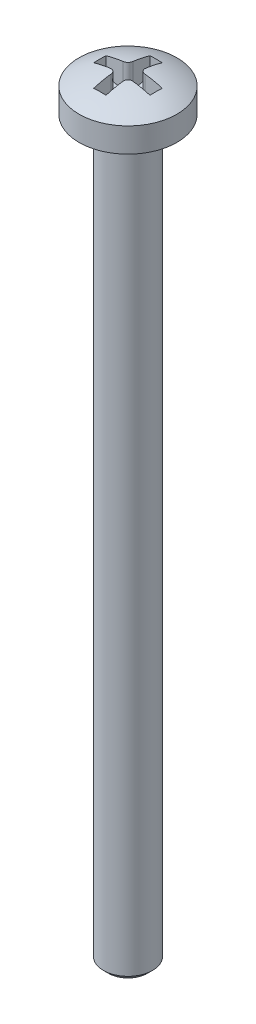
ISO-10303-21;
HEADER;
FILE_DESCRIPTION(('STEP AP214'),'2;1');
FILE_NAME('part.step','',(''),(''),'','','');
FILE_SCHEMA(('AUTOMOTIVE_DESIGN { 1 0 10303 214 1 1 1 1 }'));
ENDSEC;
DATA;
#1=APPLICATION_CONTEXT('core data for automotive mechanical design processes');
#2=APPLICATION_PROTOCOL_DEFINITION('international standard','automotive_design',2000,#1);
#3=PRODUCT_CONTEXT('',#1,'mechanical');
#4=PRODUCT('Part','Part','',(#3));
#5=PRODUCT_RELATED_PRODUCT_CATEGORY('part','',(#4));
#6=PRODUCT_DEFINITION_FORMATION('','',#4);
#7=PRODUCT_DEFINITION_CONTEXT('part definition',#1,'design');
#8=PRODUCT_DEFINITION('design','',#6,#7);
#9=PRODUCT_DEFINITION_SHAPE('','',#8);
#10=(LENGTH_UNIT() NAMED_UNIT(*) SI_UNIT(.MILLI.,.METRE.));
#11=(NAMED_UNIT(*) PLANE_ANGLE_UNIT() SI_UNIT($,.RADIAN.));
#12=(NAMED_UNIT(*) SI_UNIT($,.STERADIAN.) SOLID_ANGLE_UNIT());
#13=UNCERTAINTY_MEASURE_WITH_UNIT(LENGTH_MEASURE(1.E-05),#10,'distance_accuracy_value','');
#14=(GEOMETRIC_REPRESENTATION_CONTEXT(3) GLOBAL_UNCERTAINTY_ASSIGNED_CONTEXT((#13)) GLOBAL_UNIT_ASSIGNED_CONTEXT((#10,
#11,#12)) REPRESENTATION_CONTEXT('',''));
#15=CARTESIAN_POINT('',(0.,0.,0.));
#16=DIRECTION('',(0.,0.,1.));
#17=DIRECTION('',(1.,0.,0.));
#18=AXIS2_PLACEMENT_3D('',#15,#16,#17);
#19=CARTESIAN_POINT('',(2.00000000000001,-60.,0.));
#20=DIRECTION('',(0.,1.,0.));
#21=DIRECTION('',(0.,0.,1.));
#22=AXIS2_PLACEMENT_3D('',#19,#20,#21);
#23=PLANE('',#22);
#24=CARTESIAN_POINT('',(0.,-60.,0.));
#25=DIRECTION('',(0.,1.,0.));
#26=DIRECTION('',(0.,0.,1.));
#27=AXIS2_PLACEMENT_3D('',#24,#25,#26);
#28=CIRCLE('',#27,1.6);
#29=CARTESIAN_POINT('',(0.,-60.,1.6));
#30=VERTEX_POINT('',#29);
#31=EDGE_CURVE('E11',#30,#30,#28,.F.);
#32=ORIENTED_EDGE('',*,*,#31,.T.);
#33=EDGE_LOOP('',(#32));
#34=FACE_BOUND('',#33,.T.);
#35=ADVANCED_FACE('F37',(#34),#23,.F.);
#36=CARTESIAN_POINT('',(0.,-4.72272727272728,0.));
#37=DIRECTION('',(0.,1.,0.));
#38=DIRECTION('',(1.,0.,0.));
#39=AXIS2_PLACEMENT_3D('',#36,#37,#38);
#40=SPHERICAL_SURFACE('',#39,7.82272727272728);
#41=CARTESIAN_POINT('',(0.5,-4.72272727272728,0.));
#42=DIRECTION('',(1.,0.,0.));
#43=DIRECTION('',(0.,0.,-1.));
#44=AXIS2_PLACEMENT_3D('',#41,#42,#43);
#45=CIRCLE('',#44,7.80673183755348);
#46=CARTESIAN_POINT('',(0.5,2.73750476008987,-2.3));
#47=VERTEX_POINT('',#46);
#48=CARTESIAN_POINT('',(0.5,3.03195273249996,-0.9));
#49=VERTEX_POINT('',#48);
#50=EDGE_CURVE('E195',#47,#49,#45,.T.);
#51=ORIENTED_EDGE('',*,*,#50,.T.);
#52=CARTESIAN_POINT('',(0.5,3.03195273249996,-0.9));
#53=CARTESIAN_POINT('',(0.499980445653111,3.03454133641409,-0.877715199489853));
#54=CARTESIAN_POINT('',(0.501861325410847,3.0369109081898,-0.855406290685576));
#55=CARTESIAN_POINT('',(0.509308944557218,3.04115309750786,-0.811373363194762));
#56=CARTESIAN_POINT('',(0.514874142284133,3.04302592244948,-0.789649103823202));
#57=CARTESIAN_POINT('',(0.529581237998282,3.04621922226135,-0.747382590966706));
#58=CARTESIAN_POINT('',(0.538725894104163,3.0475392695665,-0.726841263013532));
#59=CARTESIAN_POINT('',(0.560335395409864,3.04958563422558,-0.687561895208892));
#60=CARTESIAN_POINT('',(0.572799188800053,3.05031213937239,-0.668823286645484));
#61=CARTESIAN_POINT('',(0.600596407799792,3.05114682561896,-0.633816736919395));
#62=CARTESIAN_POINT('',(0.615908512897499,3.05125942358876,-0.617531968951503));
#63=CARTESIAN_POINT('',(0.649026593510928,3.0508747494218,-0.587736528915892));
#64=CARTESIAN_POINT('',(0.666832948845617,3.05037738431157,-0.57422628012003));
#65=CARTESIAN_POINT('',(0.704363578386314,3.04879030089852,-0.550401537052683));
#66=CARTESIAN_POINT('',(0.724081674108829,3.04770244181268,-0.540077170971166));
#67=CARTESIAN_POINT('',(0.764919862434989,3.04496752601447,-0.522847557382613));
#68=CARTESIAN_POINT('',(0.786039420133905,3.04332068167708,-0.515941013789886));
#69=CARTESIAN_POINT('',(0.822714805755103,3.04007942212771,-0.5072274099574));
#70=CARTESIAN_POINT('',(0.838074093965798,3.03861284502167,-0.504517057384848));
#71=CARTESIAN_POINT('',(0.868957976534767,3.0354499847468,-0.500903202638105));
#72=CARTESIAN_POINT('',(0.88448230264661,3.03375403356009,-0.499997118337815));
#73=CARTESIAN_POINT('',(0.9,3.03195273249996,-0.5));
#74=B_SPLINE_CURVE_WITH_KNOTS('',3,(#52,#53,#54,#55,#56,#57,#58,#59,#60,#61,#62,#63,#64,#65,#66,
#67,#68,#69,#70,#71,#72,#73),.UNSPECIFIED.,.F.,.F.,(4,2,2,2,2,2,2,2,2,2,4),(0.,
0.0672224170043276,0.134416723302517,0.201662907801201,0.26888780779591,0.335628401088124,
0.402379168562592,0.468920974876219,0.535437528240593,0.582332561709017,0.629160434341086),.UNSPECIFIED.);
#75=CARTESIAN_POINT('',(0.9,3.03195273249996,-0.5));
#76=VERTEX_POINT('',#75);
#77=EDGE_CURVE('E257',#49,#76,#74,.T.);
#78=ORIENTED_EDGE('',*,*,#77,.T.);
#79=CARTESIAN_POINT('',(0.,-4.72272727272728,-0.5));
#80=DIRECTION('',(0.,0.,-1.));
#81=DIRECTION('',(-1.,0.,0.));
#82=AXIS2_PLACEMENT_3D('',#79,#80,#81);
#83=CIRCLE('',#82,7.80673183755348);
#84=CARTESIAN_POINT('',(2.3,2.73750476008987,-0.5));
#85=VERTEX_POINT('',#84);
#86=EDGE_CURVE('E193',#76,#85,#83,.T.);
#87=ORIENTED_EDGE('',*,*,#86,.T.);
#88=CARTESIAN_POINT('',(2.3,-4.72272727272728,0.));
#89=DIRECTION('',(1.,0.,0.));
#90=DIRECTION('',(0.,0.,-1.));
#91=AXIS2_PLACEMENT_3D('',#88,#89,#90);
#92=CIRCLE('',#91,7.47696876972688);
#93=CARTESIAN_POINT('',(2.3,2.73750476008987,0.5));
#94=VERTEX_POINT('',#93);
#95=EDGE_CURVE('E170',#85,#94,#92,.T.);
#96=ORIENTED_EDGE('',*,*,#95,.T.);
#97=CARTESIAN_POINT('',(0.,-4.72272727272728,0.5));
#98=DIRECTION('',(0.,0.,1.));
#99=DIRECTION('',(1.,0.,0.));
#100=AXIS2_PLACEMENT_3D('',#97,#98,#99);
#101=CIRCLE('',#100,7.80673183755348);
#102=CARTESIAN_POINT('',(0.9,3.03195273249996,0.5));
#103=VERTEX_POINT('',#102);
#104=EDGE_CURVE('E219',#94,#103,#101,.T.);
#105=ORIENTED_EDGE('',*,*,#104,.T.);
#106=CARTESIAN_POINT('',(0.9,3.03195273249996,0.5));
#107=CARTESIAN_POINT('',(0.877715199489853,3.03454133641409,0.499980445653111));
#108=CARTESIAN_POINT('',(0.855406290685576,3.0369109081898,0.501861325410847));
#109=CARTESIAN_POINT('',(0.811373363194762,3.04115309750786,0.509308944557218));
#110=CARTESIAN_POINT('',(0.789649103823202,3.04302592244948,0.514874142284133));
#111=CARTESIAN_POINT('',(0.747382590966706,3.04621922226135,0.529581237998282));
#112=CARTESIAN_POINT('',(0.726841263013532,3.0475392695665,0.538725894104163));
#113=CARTESIAN_POINT('',(0.687561895208891,3.04958563422558,0.560335395409864));
#114=CARTESIAN_POINT('',(0.668823286645484,3.05031213937239,0.572799188800053));
#115=CARTESIAN_POINT('',(0.633816736919395,3.05114682561896,0.600596407799792));
#116=CARTESIAN_POINT('',(0.617531968951503,3.05125942358877,0.6159085128975));
#117=CARTESIAN_POINT('',(0.587736528915892,3.0508747494218,0.649026593510929));
#118=CARTESIAN_POINT('',(0.57422628012003,3.05037738431157,0.666832948845617));
#119=CARTESIAN_POINT('',(0.550401537052683,3.04879030089852,0.704363578386314));
#120=CARTESIAN_POINT('',(0.540077170971166,3.04770244181268,0.724081674108829));
#121=CARTESIAN_POINT('',(0.522847557382613,3.04496752601447,0.764919862434989));
#122=CARTESIAN_POINT('',(0.515941013789886,3.04332068167708,0.786039420133905));
#123=CARTESIAN_POINT('',(0.5072274099574,3.04007942212771,0.822714805755103));
#124=CARTESIAN_POINT('',(0.504517057384848,3.03861284502167,0.838074093965798));
#125=CARTESIAN_POINT('',(0.500903202638105,3.03544998474679,0.868957976534767));
#126=CARTESIAN_POINT('',(0.499997118337815,3.03375403356009,0.884482302646609));
#127=CARTESIAN_POINT('',(0.5,3.03195273249996,0.9));
#128=B_SPLINE_CURVE_WITH_KNOTS('',3,(#106,#107,#108,#109,#110,#111,#112,#113,#114,#115,#116,
#117,#118,#119,#120,#121,#122,#123,#124,#125,#126,#127),.UNSPECIFIED.,.F.,.F.,(4,2,2,2,2,2,2,2,
2,2,4),(0.,0.0672224170043276,0.134416723302517,0.201662907801201,0.268887807795911,
0.335628401088124,0.402379168562592,0.468920974876219,0.535437528240593,0.582332561709017,
0.629160434341086),.UNSPECIFIED.);
#129=CARTESIAN_POINT('',(0.5,3.03195273249996,0.9));
#130=VERTEX_POINT('',#129);
#131=EDGE_CURVE('E252',#103,#130,#128,.T.);
#132=ORIENTED_EDGE('',*,*,#131,.T.);
#133=CARTESIAN_POINT('',(0.5,-4.72272727272728,0.));
#134=DIRECTION('',(1.,0.,0.));
#135=DIRECTION('',(0.,0.,-1.));
#136=AXIS2_PLACEMENT_3D('',#133,#134,#135);
#137=CIRCLE('',#136,7.80673183755348);
#138=CARTESIAN_POINT('',(0.5,2.73750476008987,2.3));
#139=VERTEX_POINT('',#138);
#140=EDGE_CURVE('E217',#130,#139,#137,.T.);
#141=ORIENTED_EDGE('',*,*,#140,.T.);
#142=CARTESIAN_POINT('',(0.,-4.72272727272728,2.3));
#143=DIRECTION('',(0.,0.,1.));
#144=DIRECTION('',(1.,0.,0.));
#145=AXIS2_PLACEMENT_3D('',#142,#143,#144);
#146=CIRCLE('',#145,7.47696876972688);
#147=CARTESIAN_POINT('',(-0.5,2.73750476008987,2.3));
#148=VERTEX_POINT('',#147);
#149=EDGE_CURVE('E214',#139,#148,#146,.T.);
#150=ORIENTED_EDGE('',*,*,#149,.T.);
#151=CARTESIAN_POINT('',(-0.5,-4.72272727272728,0.));
#152=DIRECTION('',(-1.,0.,0.));
#153=DIRECTION('',(0.,0.,1.));
#154=AXIS2_PLACEMENT_3D('',#151,#152,#153);
#155=CIRCLE('',#154,7.80673183755348);
#156=CARTESIAN_POINT('',(-0.5,3.03195273249996,0.9));
#157=VERTEX_POINT('',#156);
#158=EDGE_CURVE('E211',#148,#157,#155,.T.);
#159=ORIENTED_EDGE('',*,*,#158,.T.);
#160=CARTESIAN_POINT('',(-0.5,3.03195273249996,0.9));
#161=CARTESIAN_POINT('',(-0.499980445653111,3.03454133641409,0.877715199489853));
#162=CARTESIAN_POINT('',(-0.501861325410847,3.0369109081898,0.855406290685576));
#163=CARTESIAN_POINT('',(-0.509308944557218,3.04115309750786,0.811373363194762));
#164=CARTESIAN_POINT('',(-0.514874142284133,3.04302592244948,0.789649103823202));
#165=CARTESIAN_POINT('',(-0.529581237998282,3.04621922226135,0.747382590966706));
#166=CARTESIAN_POINT('',(-0.538725894104163,3.0475392695665,0.726841263013532));
#167=CARTESIAN_POINT('',(-0.560335395409864,3.04958563422558,0.687561895208892));
#168=CARTESIAN_POINT('',(-0.572799188800053,3.05031213937239,0.668823286645484));
#169=CARTESIAN_POINT('',(-0.600596407799792,3.05114682561896,0.633816736919395));
#170=CARTESIAN_POINT('',(-0.6159085128975,3.05125942358876,0.617531968951503));
#171=CARTESIAN_POINT('',(-0.649026593510929,3.0508747494218,0.587736528915892));
#172=CARTESIAN_POINT('',(-0.666832948845617,3.05037738431157,0.57422628012003));
#173=CARTESIAN_POINT('',(-0.704363578386314,3.04879030089852,0.550401537052683));
#174=CARTESIAN_POINT('',(-0.724081674108829,3.04770244181268,0.540077170971166));
#175=CARTESIAN_POINT('',(-0.764919862434989,3.04496752601447,0.522847557382613));
#176=CARTESIAN_POINT('',(-0.786039420133905,3.04332068167708,0.515941013789887));
#177=CARTESIAN_POINT('',(-0.822714805755103,3.04007942212771,0.5072274099574));
#178=CARTESIAN_POINT('',(-0.838074093965798,3.03861284502167,0.504517057384848));
#179=CARTESIAN_POINT('',(-0.868957976534767,3.0354499847468,0.500903202638105));
#180=CARTESIAN_POINT('',(-0.88448230264661,3.03375403356009,0.499997118337815));
#181=CARTESIAN_POINT('',(-0.9,3.03195273249996,0.5));
#182=B_SPLINE_CURVE_WITH_KNOTS('',3,(#160,#161,#162,#163,#164,#165,#166,#167,#168,#169,#170,
#171,#172,#173,#174,#175,#176,#177,#178,#179,#180,#181),.UNSPECIFIED.,.F.,.F.,(4,2,2,2,2,2,2,2,
2,2,4),(0.,0.0672224170043276,0.134416723302517,0.201662907801201,0.26888780779591,
0.335628401088124,0.402379168562592,0.468920974876219,0.535437528240592,0.582332561709017,
0.629160434341086),.UNSPECIFIED.);
#183=CARTESIAN_POINT('',(-0.9,3.03195273249996,0.5));
#184=VERTEX_POINT('',#183);
#185=EDGE_CURVE('E231',#157,#184,#182,.T.);
#186=ORIENTED_EDGE('',*,*,#185,.T.);
#187=CARTESIAN_POINT('',(0.,-4.72272727272728,0.5));
#188=DIRECTION('',(0.,0.,1.));
#189=DIRECTION('',(1.,0.,0.));
#190=AXIS2_PLACEMENT_3D('',#187,#188,#189);
#191=CIRCLE('',#190,7.80673183755348);
#192=CARTESIAN_POINT('',(-2.3,2.73750476008987,0.5));
#193=VERTEX_POINT('',#192);
#194=EDGE_CURVE('E209',#184,#193,#191,.T.);
#195=ORIENTED_EDGE('',*,*,#194,.T.);
#196=CARTESIAN_POINT('',(-2.3,-4.72272727272728,0.));
#197=DIRECTION('',(-1.,0.,0.));
#198=DIRECTION('',(0.,0.,1.));
#199=AXIS2_PLACEMENT_3D('',#196,#197,#198);
#200=CIRCLE('',#199,7.47696876972688);
#201=CARTESIAN_POINT('',(-2.3,2.73750476008987,-0.5));
#202=VERTEX_POINT('',#201);
#203=EDGE_CURVE('E206',#193,#202,#200,.T.);
#204=ORIENTED_EDGE('',*,*,#203,.T.);
#205=CARTESIAN_POINT('',(0.,-4.72272727272728,-0.5));
#206=DIRECTION('',(0.,0.,-1.));
#207=DIRECTION('',(-1.,0.,0.));
#208=AXIS2_PLACEMENT_3D('',#205,#206,#207);
#209=CIRCLE('',#208,7.80673183755348);
#210=CARTESIAN_POINT('',(-0.9,3.03195273249996,-0.5));
#211=VERTEX_POINT('',#210);
#212=EDGE_CURVE('E203',#202,#211,#209,.T.);
#213=ORIENTED_EDGE('',*,*,#212,.T.);
#214=CARTESIAN_POINT('',(-0.9,3.03195273249996,-0.5));
#215=CARTESIAN_POINT('',(-0.877715199489853,3.03454133641409,-0.499980445653111));
#216=CARTESIAN_POINT('',(-0.855406290685576,3.0369109081898,-0.501861325410847));
#217=CARTESIAN_POINT('',(-0.811373363194762,3.04115309750786,-0.509308944557218));
#218=CARTESIAN_POINT('',(-0.789649103823202,3.04302592244948,-0.514874142284133));
#219=CARTESIAN_POINT('',(-0.747382590966706,3.04621922226135,-0.529581237998282));
#220=CARTESIAN_POINT('',(-0.726841263013532,3.0475392695665,-0.538725894104163));
#221=CARTESIAN_POINT('',(-0.687561895208892,3.04958563422558,-0.560335395409864));
#222=CARTESIAN_POINT('',(-0.668823286645484,3.05031213937239,-0.572799188800053));
#223=CARTESIAN_POINT('',(-0.633816736919395,3.05114682561896,-0.600596407799792));
#224=CARTESIAN_POINT('',(-0.617531968951503,3.05125942358877,-0.6159085128975));
#225=CARTESIAN_POINT('',(-0.587736528915892,3.0508747494218,-0.649026593510929));
#226=CARTESIAN_POINT('',(-0.57422628012003,3.05037738431157,-0.666832948845617));
#227=CARTESIAN_POINT('',(-0.550401537052683,3.04879030089852,-0.704363578386314));
#228=CARTESIAN_POINT('',(-0.540077170971166,3.04770244181268,-0.724081674108829));
#229=CARTESIAN_POINT('',(-0.522847557382613,3.04496752601447,-0.764919862434989));
#230=CARTESIAN_POINT('',(-0.515941013789887,3.04332068167708,-0.786039420133905));
#231=CARTESIAN_POINT('',(-0.5072274099574,3.04007942212771,-0.822714805755103));
#232=CARTESIAN_POINT('',(-0.504517057384848,3.03861284502167,-0.838074093965798));
#233=CARTESIAN_POINT('',(-0.500903202638105,3.03544998474679,-0.868957976534767));
#234=CARTESIAN_POINT('',(-0.499997118337815,3.03375403356009,-0.88448230264661));
#235=CARTESIAN_POINT('',(-0.5,3.03195273249996,-0.9));
#236=B_SPLINE_CURVE_WITH_KNOTS('',3,(#214,#215,#216,#217,#218,#219,#220,#221,#222,#223,#224,
#225,#226,#227,#228,#229,#230,#231,#232,#233,#234,#235),.UNSPECIFIED.,.F.,.F.,(4,2,2,2,2,2,2,2,
2,2,4),(0.,0.0672224170043276,0.134416723302517,0.201662907801201,0.268887807795911,
0.335628401088124,0.402379168562592,0.468920974876219,0.535437528240593,0.582332561709018,
0.629160434341086),.UNSPECIFIED.);
#237=CARTESIAN_POINT('',(-0.5,3.03195273249996,-0.9));
#238=VERTEX_POINT('',#237);
#239=EDGE_CURVE('E225',#211,#238,#236,.T.);
#240=ORIENTED_EDGE('',*,*,#239,.T.);
#241=CARTESIAN_POINT('',(-0.5,-4.72272727272728,0.));
#242=DIRECTION('',(-1.,0.,0.));
#243=DIRECTION('',(0.,0.,1.));
#244=AXIS2_PLACEMENT_3D('',#241,#242,#243);
#245=CIRCLE('',#244,7.80673183755348);
#246=CARTESIAN_POINT('',(-0.5,2.73750476008987,-2.3));
#247=VERTEX_POINT('',#246);
#248=EDGE_CURVE('E201',#238,#247,#245,.T.);
#249=ORIENTED_EDGE('',*,*,#248,.T.);
#250=CARTESIAN_POINT('',(0.,-4.72272727272728,-2.3));
#251=DIRECTION('',(0.,0.,-1.));
#252=DIRECTION('',(-1.,0.,0.));
#253=AXIS2_PLACEMENT_3D('',#250,#251,#252);
#254=CIRCLE('',#253,7.47696876972688);
#255=EDGE_CURVE('E198',#247,#47,#254,.T.);
#256=ORIENTED_EDGE('',*,*,#255,.T.);
#257=EDGE_LOOP('',(#51,#78,#87,#96,#105,#132,#141,#150,#159,#186,#195,#204,#213,#240,#249,#256));
#258=FACE_BOUND('',#257,.T.);
#259=CARTESIAN_POINT('',(0.,2.,0.));
#260=DIRECTION('',(0.,1.,0.));
#261=DIRECTION('',(0.,0.,1.));
#262=AXIS2_PLACEMENT_3D('',#259,#260,#261);
#263=CIRCLE('',#262,4.);
#264=CARTESIAN_POINT('',(0.,2.,4.));
#265=VERTEX_POINT('',#264);
#266=EDGE_CURVE('E189',#265,#265,#263,.T.);
#267=ORIENTED_EDGE('',*,*,#266,.T.);
#268=EDGE_LOOP('',(#267));
#269=FACE_BOUND('',#268,.T.);
#270=ADVANCED_FACE('F239',(#258,#269),#40,.T.);
#271=CARTESIAN_POINT('',(0.,3.1,0.));
#272=DIRECTION('',(0.,1.,0.));
#273=DIRECTION('',(0.,0.,1.));
#274=AXIS2_PLACEMENT_3D('',#271,#272,#273);
#275=CYLINDRICAL_SURFACE('',#274,4.);
#276=ORIENTED_EDGE('',*,*,#266,.F.);
#277=EDGE_LOOP('',(#276));
#278=FACE_BOUND('',#277,.T.);
#279=CARTESIAN_POINT('',(0.,0.,0.));
#280=DIRECTION('',(0.,1.,0.));
#281=DIRECTION('',(0.,0.,1.));
#282=AXIS2_PLACEMENT_3D('',#279,#280,#281);
#283=CIRCLE('',#282,4.);
#284=CARTESIAN_POINT('',(0.,0.,4.));
#285=VERTEX_POINT('',#284);
#286=EDGE_CURVE('E181',#285,#285,#283,.T.);
#287=ORIENTED_EDGE('',*,*,#286,.T.);
#288=EDGE_LOOP('',(#287));
#289=FACE_BOUND('',#288,.T.);
#290=ADVANCED_FACE('F244',(#278,#289),#275,.T.);
#291=CARTESIAN_POINT('',(4.,0.,0.));
#292=DIRECTION('',(0.,1.,0.));
#293=DIRECTION('',(0.,0.,1.));
#294=AXIS2_PLACEMENT_3D('',#291,#292,#293);
#295=PLANE('',#294);
#296=ORIENTED_EDGE('',*,*,#286,.F.);
#297=EDGE_LOOP('',(#296));
#298=FACE_BOUND('',#297,.T.);
#299=CARTESIAN_POINT('',(0.,0.,0.));
#300=DIRECTION('',(0.,1.,0.));
#301=DIRECTION('',(0.,0.,1.));
#302=AXIS2_PLACEMENT_3D('',#299,#300,#301);
#303=CIRCLE('',#302,2.);
#304=CARTESIAN_POINT('',(0.,0.,2.));
#305=VERTEX_POINT('',#304);
#306=EDGE_CURVE('E178',#305,#305,#303,.T.);
#307=ORIENTED_EDGE('',*,*,#306,.T.);
#308=EDGE_LOOP('',(#307));
#309=FACE_BOUND('',#308,.T.);
#310=ADVANCED_FACE('F331',(#298,#309),#295,.F.);
#311=CARTESIAN_POINT('',(0.,3.1,0.));
#312=DIRECTION('',(0.,1.,0.));
#313=DIRECTION('',(0.,0.,1.));
#314=AXIS2_PLACEMENT_3D('',#311,#312,#313);
#315=CYLINDRICAL_SURFACE('',#314,2.);
#316=CARTESIAN_POINT('',(0.,-59.6,0.));
#317=DIRECTION('',(0.,1.,0.));
#318=DIRECTION('',(0.,0.,1.));
#319=AXIS2_PLACEMENT_3D('',#316,#317,#318);
#320=CIRCLE('',#319,2.);
#321=CARTESIAN_POINT('',(0.,-59.6,2.));
#322=VERTEX_POINT('',#321);
#323=EDGE_CURVE('E45',#322,#322,#320,.T.);
#324=ORIENTED_EDGE('',*,*,#323,.T.);
#325=EDGE_LOOP('',(#324));
#326=FACE_BOUND('',#325,.T.);
#327=ORIENTED_EDGE('',*,*,#306,.F.);
#328=EDGE_LOOP('',(#327));
#329=FACE_BOUND('',#328,.T.);
#330=ADVANCED_FACE('F303',(#326,#329),#315,.T.);
#331=CARTESIAN_POINT('',(0.5,-60.001,0.5));
#332=DIRECTION('',(0.,0.,1.));
#333=DIRECTION('',(1.,0.,0.));
#334=AXIS2_PLACEMENT_3D('',#331,#332,#333);
#335=PLANE('',#334);
#336=CARTESIAN_POINT('',(0.,9.49999999999998,0.5));
#337=DIRECTION('',(0.,0.,1.));
#338=DIRECTION('',(1.,0.,0.));
#339=AXIS2_PLACEMENT_3D('',#336,#337,#338);
#340=CIRCLE('',#339,8.48528137423855);
#341=CARTESIAN_POINT('',(2.3,1.3323810079069,0.5));
#342=VERTEX_POINT('',#341);
#343=CARTESIAN_POINT('',(0.9,1.06258333374486,0.5));
#344=VERTEX_POINT('',#343);
#345=EDGE_CURVE('E176',#342,#344,#340,.F.);
#346=ORIENTED_EDGE('',*,*,#345,.T.);
#347=DIRECTION('',(0.,1.,0.));
#348=VECTOR('',#347,1.);
#349=CARTESIAN_POINT('',(0.9,-60.001,0.5));
#350=LINE('',#349,#348);
#351=EDGE_CURVE('E556',#344,#103,#350,.T.);
#352=ORIENTED_EDGE('',*,*,#351,.T.);
#353=ORIENTED_EDGE('',*,*,#104,.F.);
#354=DIRECTION('',(0.,1.,0.));
#355=VECTOR('',#354,1.);
#356=CARTESIAN_POINT('',(2.3,-60.001,0.5));
#357=LINE('',#356,#355);
#358=EDGE_CURVE('E172',#342,#94,#357,.T.);
#359=ORIENTED_EDGE('',*,*,#358,.F.);
#360=EDGE_LOOP('',(#346,#352,#353,#359));
#361=FACE_BOUND('',#360,.T.);
#362=ADVANCED_FACE('F344',(#361),#335,.F.);
#363=CARTESIAN_POINT('',(0.5,-60.001,0.5));
#364=DIRECTION('',(1.,0.,0.));
#365=DIRECTION('',(0.,0.,-1.));
#366=AXIS2_PLACEMENT_3D('',#363,#364,#365);
#367=PLANE('',#366);
#368=ORIENTED_EDGE('',*,*,#140,.F.);
#369=DIRECTION('',(0.,1.,0.));
#370=VECTOR('',#369,1.);
#371=CARTESIAN_POINT('',(0.5,-60.001,0.9));
#372=LINE('',#371,#370);
#373=CARTESIAN_POINT('',(0.5,1.06258333374486,0.9));
#374=VERTEX_POINT('',#373);
#375=EDGE_CURVE('E554',#130,#374,#372,.F.);
#376=ORIENTED_EDGE('',*,*,#375,.T.);
#377=CARTESIAN_POINT('',(0.5,9.49999999999998,0.));
#378=DIRECTION('',(1.,0.,0.));
#379=DIRECTION('',(0.,0.,-1.));
#380=AXIS2_PLACEMENT_3D('',#377,#378,#379);
#381=CIRCLE('',#380,8.48528137423855);
#382=CARTESIAN_POINT('',(0.5,1.3323810079069,2.3));
#383=VERTEX_POINT('',#382);
#384=EDGE_CURVE('E183',#374,#383,#381,.F.);
#385=ORIENTED_EDGE('',*,*,#384,.T.);
#386=DIRECTION('',(0.,1.,0.));
#387=VECTOR('',#386,1.);
#388=CARTESIAN_POINT('',(0.5,-60.001,2.3));
#389=LINE('',#388,#387);
#390=EDGE_CURVE('E162',#383,#139,#389,.T.);
#391=ORIENTED_EDGE('',*,*,#390,.T.);
#392=EDGE_LOOP('',(#368,#376,#385,#391));
#393=FACE_BOUND('',#392,.T.);
#394=ADVANCED_FACE('F292',(#393),#367,.F.);
#395=CARTESIAN_POINT('',(-0.5,-60.001,2.3));
#396=DIRECTION('',(0.,0.,1.));
#397=DIRECTION('',(1.,0.,0.));
#398=AXIS2_PLACEMENT_3D('',#395,#396,#397);
#399=PLANE('',#398);
#400=ORIENTED_EDGE('',*,*,#390,.F.);
#401=CARTESIAN_POINT('',(0.,9.49999999999998,2.3));
#402=DIRECTION('',(0.,0.,1.));
#403=DIRECTION('',(1.,0.,0.));
#404=AXIS2_PLACEMENT_3D('',#401,#402,#403);
#405=CIRCLE('',#404,8.18290901819149);
#406=CARTESIAN_POINT('',(-0.5,1.3323810079069,2.3));
#407=VERTEX_POINT('',#406);
#408=EDGE_CURVE('E518',#383,#407,#405,.F.);
#409=ORIENTED_EDGE('',*,*,#408,.T.);
#410=DIRECTION('',(0.,1.,0.));
#411=VECTOR('',#410,1.);
#412=CARTESIAN_POINT('',(-0.5,-60.001,2.3));
#413=LINE('',#412,#411);
#414=EDGE_CURVE('E517',#407,#148,#413,.T.);
#415=ORIENTED_EDGE('',*,*,#414,.T.);
#416=ORIENTED_EDGE('',*,*,#149,.F.);
#417=EDGE_LOOP('',(#400,#409,#415,#416));
#418=FACE_BOUND('',#417,.T.);
#419=ADVANCED_FACE('F357',(#418),#399,.F.);
#420=CARTESIAN_POINT('',(-0.5,-60.001,0.5));
#421=DIRECTION('',(-1.,0.,0.));
#422=DIRECTION('',(0.,0.,1.));
#423=AXIS2_PLACEMENT_3D('',#420,#421,#422);
#424=PLANE('',#423);
#425=CARTESIAN_POINT('',(-0.5,9.49999999999998,0.));
#426=DIRECTION('',(-1.,0.,0.));
#427=DIRECTION('',(0.,0.,1.));
#428=AXIS2_PLACEMENT_3D('',#425,#426,#427);
#429=CIRCLE('',#428,8.48528137423855);
#430=CARTESIAN_POINT('',(-0.5,1.06258333374486,0.9));
#431=VERTEX_POINT('',#430);
#432=EDGE_CURVE('E512',#407,#431,#429,.F.);
#433=ORIENTED_EDGE('',*,*,#432,.T.);
#434=DIRECTION('',(0.,1.,0.));
#435=VECTOR('',#434,1.);
#436=CARTESIAN_POINT('',(-0.5,-60.001,0.9));
#437=LINE('',#436,#435);
#438=EDGE_CURVE('E507',#431,#157,#437,.T.);
#439=ORIENTED_EDGE('',*,*,#438,.T.);
#440=ORIENTED_EDGE('',*,*,#158,.F.);
#441=ORIENTED_EDGE('',*,*,#414,.F.);
#442=EDGE_LOOP('',(#433,#439,#440,#441));
#443=FACE_BOUND('',#442,.T.);
#444=ADVANCED_FACE('F364',(#443),#424,.F.);
#445=CARTESIAN_POINT('',(-2.3,-60.001,0.5));
#446=DIRECTION('',(0.,0.,1.));
#447=DIRECTION('',(1.,0.,0.));
#448=AXIS2_PLACEMENT_3D('',#445,#446,#447);
#449=PLANE('',#448);
#450=ORIENTED_EDGE('',*,*,#194,.F.);
#451=DIRECTION('',(0.,1.,0.));
#452=VECTOR('',#451,1.);
#453=CARTESIAN_POINT('',(-0.9,-60.001,0.5));
#454=LINE('',#453,#452);
#455=CARTESIAN_POINT('',(-0.9,1.06258333374486,0.5));
#456=VERTEX_POINT('',#455);
#457=EDGE_CURVE('E505',#184,#456,#454,.F.);
#458=ORIENTED_EDGE('',*,*,#457,.T.);
#459=CARTESIAN_POINT('',(0.,9.49999999999998,0.5));
#460=DIRECTION('',(0.,0.,1.));
#461=DIRECTION('',(1.,0.,0.));
#462=AXIS2_PLACEMENT_3D('',#459,#460,#461);
#463=CIRCLE('',#462,8.48528137423855);
#464=CARTESIAN_POINT('',(-2.3,1.3323810079069,0.5));
#465=VERTEX_POINT('',#464);
#466=EDGE_CURVE('E515',#456,#465,#463,.F.);
#467=ORIENTED_EDGE('',*,*,#466,.T.);
#468=DIRECTION('',(0.,1.,0.));
#469=VECTOR('',#468,1.);
#470=CARTESIAN_POINT('',(-2.3,-60.001,0.5));
#471=LINE('',#470,#469);
#472=EDGE_CURVE('E529',#465,#193,#471,.T.);
#473=ORIENTED_EDGE('',*,*,#472,.T.);
#474=EDGE_LOOP('',(#450,#458,#467,#473));
#475=FACE_BOUND('',#474,.T.);
#476=ADVANCED_FACE('F371',(#475),#449,.F.);
#477=CARTESIAN_POINT('',(-2.3,-60.001,-0.5));
#478=DIRECTION('',(-1.,0.,0.));
#479=DIRECTION('',(0.,0.,1.));
#480=AXIS2_PLACEMENT_3D('',#477,#478,#479);
#481=PLANE('',#480);
#482=ORIENTED_EDGE('',*,*,#472,.F.);
#483=CARTESIAN_POINT('',(-2.3,9.49999999999998,0.));
#484=DIRECTION('',(-1.,0.,0.));
#485=DIRECTION('',(0.,0.,1.));
#486=AXIS2_PLACEMENT_3D('',#483,#484,#485);
#487=CIRCLE('',#486,8.18290901819149);
#488=CARTESIAN_POINT('',(-2.3,1.3323810079069,-0.5));
#489=VERTEX_POINT('',#488);
#490=EDGE_CURVE('E521',#465,#489,#487,.F.);
#491=ORIENTED_EDGE('',*,*,#490,.T.);
#492=DIRECTION('',(0.,1.,0.));
#493=VECTOR('',#492,1.);
#494=CARTESIAN_POINT('',(-2.3,-60.001,-0.5));
#495=LINE('',#494,#493);
#496=EDGE_CURVE('E532',#489,#202,#495,.T.);
#497=ORIENTED_EDGE('',*,*,#496,.T.);
#498=ORIENTED_EDGE('',*,*,#203,.F.);
#499=EDGE_LOOP('',(#482,#491,#497,#498));
#500=FACE_BOUND('',#499,.T.);
#501=ADVANCED_FACE('F379',(#500),#481,.F.);
#502=CARTESIAN_POINT('',(-2.3,-60.001,-0.5));
#503=DIRECTION('',(0.,0.,-1.));
#504=DIRECTION('',(-1.,0.,0.));
#505=AXIS2_PLACEMENT_3D('',#502,#503,#504);
#506=PLANE('',#505);
#507=CARTESIAN_POINT('',(0.,9.49999999999998,-0.5));
#508=DIRECTION('',(0.,0.,-1.));
#509=DIRECTION('',(-1.,0.,0.));
#510=AXIS2_PLACEMENT_3D('',#507,#508,#509);
#511=CIRCLE('',#510,8.48528137423855);
#512=CARTESIAN_POINT('',(-0.9,1.06258333374486,-0.5));
#513=VERTEX_POINT('',#512);
#514=EDGE_CURVE('E564',#489,#513,#511,.F.);
#515=ORIENTED_EDGE('',*,*,#514,.T.);
#516=DIRECTION('',(0.,1.,0.));
#517=VECTOR('',#516,1.);
#518=CARTESIAN_POINT('',(-0.9,-60.001,-0.5));
#519=LINE('',#518,#517);
#520=EDGE_CURVE('E549',#513,#211,#519,.T.);
#521=ORIENTED_EDGE('',*,*,#520,.T.);
#522=ORIENTED_EDGE('',*,*,#212,.F.);
#523=ORIENTED_EDGE('',*,*,#496,.F.);
#524=EDGE_LOOP('',(#515,#521,#522,#523));
#525=FACE_BOUND('',#524,.T.);
#526=ADVANCED_FACE('F387',(#525),#506,.F.);
#527=CARTESIAN_POINT('',(-0.5,-60.001,-2.3));
#528=DIRECTION('',(-1.,0.,0.));
#529=DIRECTION('',(0.,0.,1.));
#530=AXIS2_PLACEMENT_3D('',#527,#528,#529);
#531=PLANE('',#530);
#532=ORIENTED_EDGE('',*,*,#248,.F.);
#533=DIRECTION('',(0.,1.,0.));
#534=VECTOR('',#533,1.);
#535=CARTESIAN_POINT('',(-0.5,-60.001,-0.9));
#536=LINE('',#535,#534);
#537=CARTESIAN_POINT('',(-0.5,1.06258333374486,-0.9));
#538=VERTEX_POINT('',#537);
#539=EDGE_CURVE('E52',#238,#538,#536,.F.);
#540=ORIENTED_EDGE('',*,*,#539,.T.);
#541=CARTESIAN_POINT('',(-0.5,9.49999999999998,0.));
#542=DIRECTION('',(-1.,0.,0.));
#543=DIRECTION('',(0.,0.,1.));
#544=AXIS2_PLACEMENT_3D('',#541,#542,#543);
#545=CIRCLE('',#544,8.48528137423855);
#546=CARTESIAN_POINT('',(-0.5,1.3323810079069,-2.3));
#547=VERTEX_POINT('',#546);
#548=EDGE_CURVE('E560',#538,#547,#545,.F.);
#549=ORIENTED_EDGE('',*,*,#548,.T.);
#550=DIRECTION('',(0.,1.,0.));
#551=VECTOR('',#550,1.);
#552=CARTESIAN_POINT('',(-0.5,-60.001,-2.3));
#553=LINE('',#552,#551);
#554=EDGE_CURVE('E535',#547,#247,#553,.T.);
#555=ORIENTED_EDGE('',*,*,#554,.T.);
#556=EDGE_LOOP('',(#532,#540,#549,#555));
#557=FACE_BOUND('',#556,.T.);
#558=ADVANCED_FACE('F395',(#557),#531,.F.);
#559=CARTESIAN_POINT('',(-0.5,-60.001,-2.3));
#560=DIRECTION('',(0.,0.,-1.));
#561=DIRECTION('',(-1.,0.,0.));
#562=AXIS2_PLACEMENT_3D('',#559,#560,#561);
#563=PLANE('',#562);
#564=ORIENTED_EDGE('',*,*,#554,.F.);
#565=CARTESIAN_POINT('',(0.,9.49999999999998,-2.3));
#566=DIRECTION('',(0.,0.,-1.));
#567=DIRECTION('',(-1.,0.,0.));
#568=AXIS2_PLACEMENT_3D('',#565,#566,#567);
#569=CIRCLE('',#568,8.18290901819149);
#570=CARTESIAN_POINT('',(0.5,1.3323810079069,-2.3));
#571=VERTEX_POINT('',#570);
#572=EDGE_CURVE('E543',#547,#571,#569,.F.);
#573=ORIENTED_EDGE('',*,*,#572,.T.);
#574=DIRECTION('',(0.,1.,0.));
#575=VECTOR('',#574,1.);
#576=CARTESIAN_POINT('',(0.5,-60.001,-2.3));
#577=LINE('',#576,#575);
#578=EDGE_CURVE('E171',#571,#47,#577,.T.);
#579=ORIENTED_EDGE('',*,*,#578,.T.);
#580=ORIENTED_EDGE('',*,*,#255,.F.);
#581=EDGE_LOOP('',(#564,#573,#579,#580));
#582=FACE_BOUND('',#581,.T.);
#583=ADVANCED_FACE('F403',(#582),#563,.F.);
#584=CARTESIAN_POINT('',(0.5,-60.001,-2.3));
#585=DIRECTION('',(1.,0.,0.));
#586=DIRECTION('',(0.,0.,-1.));
#587=AXIS2_PLACEMENT_3D('',#584,#585,#586);
#588=PLANE('',#587);
#589=CARTESIAN_POINT('',(0.5,9.49999999999998,0.));
#590=DIRECTION('',(1.,0.,0.));
#591=DIRECTION('',(0.,0.,-1.));
#592=AXIS2_PLACEMENT_3D('',#589,#590,#591);
#593=CIRCLE('',#592,8.48528137423855);
#594=CARTESIAN_POINT('',(0.5,1.06258333374486,-0.9));
#595=VERTEX_POINT('',#594);
#596=EDGE_CURVE('E161',#571,#595,#593,.F.);
#597=ORIENTED_EDGE('',*,*,#596,.T.);
#598=DIRECTION('',(0.,1.,0.));
#599=VECTOR('',#598,1.);
#600=CARTESIAN_POINT('',(0.5,-60.001,-0.9));
#601=LINE('',#600,#599);
#602=EDGE_CURVE('E222',#595,#49,#601,.T.);
#603=ORIENTED_EDGE('',*,*,#602,.T.);
#604=ORIENTED_EDGE('',*,*,#50,.F.);
#605=ORIENTED_EDGE('',*,*,#578,.F.);
#606=EDGE_LOOP('',(#597,#603,#604,#605));
#607=FACE_BOUND('',#606,.T.);
#608=ADVANCED_FACE('F410',(#607),#588,.F.);
#609=CARTESIAN_POINT('',(0.5,-60.001,-0.5));
#610=DIRECTION('',(0.,0.,-1.));
#611=DIRECTION('',(-1.,0.,0.));
#612=AXIS2_PLACEMENT_3D('',#609,#610,#611);
#613=PLANE('',#612);
#614=ORIENTED_EDGE('',*,*,#86,.F.);
#615=DIRECTION('',(0.,1.,0.));
#616=VECTOR('',#615,1.);
#617=CARTESIAN_POINT('',(0.9,-60.001,-0.5));
#618=LINE('',#617,#616);
#619=CARTESIAN_POINT('',(0.9,1.06258333374486,-0.5));
#620=VERTEX_POINT('',#619);
#621=EDGE_CURVE('E158',#76,#620,#618,.F.);
#622=ORIENTED_EDGE('',*,*,#621,.T.);
#623=CARTESIAN_POINT('',(0.,9.49999999999998,-0.5));
#624=DIRECTION('',(0.,0.,-1.));
#625=DIRECTION('',(-1.,0.,0.));
#626=AXIS2_PLACEMENT_3D('',#623,#624,#625);
#627=CIRCLE('',#626,8.48528137423855);
#628=CARTESIAN_POINT('',(2.3,1.3323810079069,-0.5));
#629=VERTEX_POINT('',#628);
#630=EDGE_CURVE('E152',#620,#629,#627,.F.);
#631=ORIENTED_EDGE('',*,*,#630,.T.);
#632=DIRECTION('',(0.,1.,0.));
#633=VECTOR('',#632,1.);
#634=CARTESIAN_POINT('',(2.3,-60.001,-0.5));
#635=LINE('',#634,#633);
#636=EDGE_CURVE('E156',#629,#85,#635,.T.);
#637=ORIENTED_EDGE('',*,*,#636,.T.);
#638=EDGE_LOOP('',(#614,#622,#631,#637));
#639=FACE_BOUND('',#638,.T.);
#640=ADVANCED_FACE('F155',(#639),#613,.F.);
#641=CARTESIAN_POINT('',(2.3,-60.001,-0.5));
#642=DIRECTION('',(1.,0.,0.));
#643=DIRECTION('',(0.,0.,-1.));
#644=AXIS2_PLACEMENT_3D('',#641,#642,#643);
#645=PLANE('',#644);
#646=ORIENTED_EDGE('',*,*,#636,.F.);
#647=CARTESIAN_POINT('',(2.3,9.49999999999998,0.));
#648=DIRECTION('',(1.,0.,0.));
#649=DIRECTION('',(0.,0.,-1.));
#650=AXIS2_PLACEMENT_3D('',#647,#648,#649);
#651=CIRCLE('',#650,8.18290901819149);
#652=EDGE_CURVE('E167',#629,#342,#651,.F.);
#653=ORIENTED_EDGE('',*,*,#652,.T.);
#654=ORIENTED_EDGE('',*,*,#358,.T.);
#655=ORIENTED_EDGE('',*,*,#95,.F.);
#656=EDGE_LOOP('',(#646,#653,#654,#655));
#657=FACE_BOUND('',#656,.T.);
#658=ADVANCED_FACE('F166',(#657),#645,.F.);
#659=CARTESIAN_POINT('',(0.,9.49999999999998,0.));
#660=DIRECTION('',(0.,1.,0.));
#661=DIRECTION('',(1.,0.,0.));
#662=AXIS2_PLACEMENT_3D('',#659,#660,#661);
#663=SPHERICAL_SURFACE('',#662,8.49999999999998);
#664=ORIENTED_EDGE('',*,*,#345,.F.);
#665=ORIENTED_EDGE('',*,*,#652,.F.);
#666=ORIENTED_EDGE('',*,*,#630,.F.);
#667=CARTESIAN_POINT('',(0.9,1.06258333374486,-0.5));
#668=CARTESIAN_POINT('',(0.877681895176581,1.06020064583187,-0.499980506377996));
#669=CARTESIAN_POINT('',(0.855344205727362,1.0580201488652,-0.501866869905914));
#670=CARTESIAN_POINT('',(0.811264196369215,1.05411756501269,-0.509332340473144));
#671=CARTESIAN_POINT('',(0.78952159882242,1.05239526097159,-0.514909693823375));
#672=CARTESIAN_POINT('',(0.747228556255667,1.04945966047884,-0.529643735623788));
#673=CARTESIAN_POINT('',(0.726678990033897,1.04824673524169,-0.538803025087882));
#674=CARTESIAN_POINT('',(0.687389852539137,1.04636746374655,-0.560442280349619));
#675=CARTESIAN_POINT('',(0.668649749482246,1.04570095646757,-0.572921266446781));
#676=CARTESIAN_POINT('',(0.633625729643449,1.04493649451643,-0.600763861630353));
#677=CARTESIAN_POINT('',(0.617327507926939,1.04483509156346,-0.616109383561911));
#678=CARTESIAN_POINT('',(0.587514637710959,1.04519463942213,-0.649299998886555));
#679=CARTESIAN_POINT('',(0.574000432084661,1.04565567962496,-0.667145489209941));
#680=CARTESIAN_POINT('',(0.55017165377276,1.04712438551599,-0.704769667803527));
#681=CARTESIAN_POINT('',(0.539848822620757,1.04813062146146,-0.724543189195622));
#682=CARTESIAN_POINT('',(0.522637980126425,1.05065941614313,-0.765498290560969));
#683=CARTESIAN_POINT('',(0.515748559609182,1.05218176262027,-0.78667928881133));
#684=CARTESIAN_POINT('',(0.507116958212197,1.05516459963325,-0.823303350164225));
#685=CARTESIAN_POINT('',(0.504448298653858,1.05650461680506,-0.838544928463922));
#686=CARTESIAN_POINT('',(0.500889732891837,1.05939256924764,-0.869192646434852));
#687=CARTESIAN_POINT('',(0.499997287547255,1.06094020433808,-0.884598519500552));
#688=CARTESIAN_POINT('',(0.5,1.06258333374486,-0.9));
#689=B_SPLINE_CURVE_WITH_KNOTS('',3,(#667,#668,#669,#670,#671,#672,#673,#674,#675,#676,#677,
#678,#679,#680,#681,#682,#683,#684,#685,#686,#687,#688),.UNSPECIFIED.,.F.,.F.,(4,2,2,2,2,2,2,2,
2,2,4),(0.,0.0672520458092346,0.134472161271656,0.201741179358209,0.268990367163335,
0.33582874565086,0.402677748396607,0.469352286257207,0.535999436300152,0.582495090258099,
0.628924229684279),.UNSPECIFIED.);
#690=EDGE_CURVE('E280',#620,#595,#689,.T.);
#691=ORIENTED_EDGE('',*,*,#690,.T.);
#692=ORIENTED_EDGE('',*,*,#596,.F.);
#693=ORIENTED_EDGE('',*,*,#572,.F.);
#694=ORIENTED_EDGE('',*,*,#548,.F.);
#695=CARTESIAN_POINT('',(-0.5,1.06258333374486,-0.9));
#696=CARTESIAN_POINT('',(-0.499980506377996,1.06020064583187,-0.877681895176581));
#697=CARTESIAN_POINT('',(-0.501866869905914,1.0580201488652,-0.855344205727362));
#698=CARTESIAN_POINT('',(-0.509332340473144,1.05411756501269,-0.811264196369215));
#699=CARTESIAN_POINT('',(-0.514909693823375,1.05239526097159,-0.789521598822421));
#700=CARTESIAN_POINT('',(-0.529643735623788,1.04945966047884,-0.747228556255667));
#701=CARTESIAN_POINT('',(-0.538803025087882,1.04824673524169,-0.726678990033897));
#702=CARTESIAN_POINT('',(-0.56044228034962,1.04636746374655,-0.687389852539137));
#703=CARTESIAN_POINT('',(-0.572921266446781,1.04570095646757,-0.668649749482246));
#704=CARTESIAN_POINT('',(-0.600763861630353,1.04493649451643,-0.633625729643449));
#705=CARTESIAN_POINT('',(-0.616109383561911,1.04483509156346,-0.617327507926939));
#706=CARTESIAN_POINT('',(-0.649299998886555,1.04519463942213,-0.58751463771096));
#707=CARTESIAN_POINT('',(-0.667145489209941,1.04565567962496,-0.574000432084661));
#708=CARTESIAN_POINT('',(-0.704769667803527,1.04712438551599,-0.550171653772761));
#709=CARTESIAN_POINT('',(-0.724543189195622,1.04813062146146,-0.539848822620758));
#710=CARTESIAN_POINT('',(-0.765498290560969,1.05065941614313,-0.522637980126425));
#711=CARTESIAN_POINT('',(-0.78667928881133,1.05218176262027,-0.515748559609182));
#712=CARTESIAN_POINT('',(-0.823303350164225,1.05516459963325,-0.507116958212197));
#713=CARTESIAN_POINT('',(-0.838544928463922,1.05650461680506,-0.504448298653858));
#714=CARTESIAN_POINT('',(-0.869192646434852,1.05939256924764,-0.500889732891837));
#715=CARTESIAN_POINT('',(-0.884598519500552,1.06094020433808,-0.499997287547255));
#716=CARTESIAN_POINT('',(-0.9,1.06258333374486,-0.5));
#717=B_SPLINE_CURVE_WITH_KNOTS('',3,(#695,#696,#697,#698,#699,#700,#701,#702,#703,#704,#705,
#706,#707,#708,#709,#710,#711,#712,#713,#714,#715,#716),.UNSPECIFIED.,.F.,.F.,(4,2,2,2,2,2,2,2,
2,2,4),(0.,0.0672520458092345,0.134472161271656,0.201741179358209,0.268990367163335,
0.33582874565086,0.402677748396607,0.469352286257207,0.535999436300152,0.582495090258099,
0.628924229684279),.UNSPECIFIED.);
#718=EDGE_CURVE('E59',#538,#513,#717,.T.);
#719=ORIENTED_EDGE('',*,*,#718,.T.);
#720=ORIENTED_EDGE('',*,*,#514,.F.);
#721=ORIENTED_EDGE('',*,*,#490,.F.);
#722=ORIENTED_EDGE('',*,*,#466,.F.);
#723=CARTESIAN_POINT('',(-0.9,1.06258333374486,0.5));
#724=CARTESIAN_POINT('',(-0.877681895176581,1.06020064583187,0.499980506377996));
#725=CARTESIAN_POINT('',(-0.855344205727362,1.0580201488652,0.501866869905914));
#726=CARTESIAN_POINT('',(-0.811264196369215,1.05411756501269,0.509332340473144));
#727=CARTESIAN_POINT('',(-0.789521598822421,1.05239526097159,0.514909693823375));
#728=CARTESIAN_POINT('',(-0.747228556255667,1.04945966047884,0.529643735623788));
#729=CARTESIAN_POINT('',(-0.726678990033897,1.04824673524169,0.538803025087882));
#730=CARTESIAN_POINT('',(-0.687389852539138,1.04636746374655,0.560442280349619));
#731=CARTESIAN_POINT('',(-0.668649749482246,1.04570095646757,0.572921266446781));
#732=CARTESIAN_POINT('',(-0.633625729643449,1.04493649451643,0.600763861630353));
#733=CARTESIAN_POINT('',(-0.617327507926939,1.04483509156346,0.616109383561911));
#734=CARTESIAN_POINT('',(-0.58751463771096,1.04519463942213,0.649299998886555));
#735=CARTESIAN_POINT('',(-0.574000432084662,1.04565567962496,0.667145489209941));
#736=CARTESIAN_POINT('',(-0.550171653772761,1.04712438551599,0.704769667803527));
#737=CARTESIAN_POINT('',(-0.539848822620758,1.04813062146146,0.724543189195622));
#738=CARTESIAN_POINT('',(-0.522637980126425,1.05065941614313,0.765498290560969));
#739=CARTESIAN_POINT('',(-0.515748559609182,1.05218176262027,0.78667928881133));
#740=CARTESIAN_POINT('',(-0.507116958212197,1.05516459963325,0.823303350164224));
#741=CARTESIAN_POINT('',(-0.504448298653859,1.05650461680506,0.838544928463921));
#742=CARTESIAN_POINT('',(-0.500889732891837,1.05939256924764,0.869192646434852));
#743=CARTESIAN_POINT('',(-0.499997287547256,1.06094020433808,0.884598519500552));
#744=CARTESIAN_POINT('',(-0.5,1.06258333374486,0.9));
#745=B_SPLINE_CURVE_WITH_KNOTS('',3,(#723,#724,#725,#726,#727,#728,#729,#730,#731,#732,#733,
#734,#735,#736,#737,#738,#739,#740,#741,#742,#743,#744),.UNSPECIFIED.,.F.,.F.,(4,2,2,2,2,2,2,2,
2,2,4),(0.,0.0672520458092345,0.134472161271656,0.201741179358209,0.268990367163335,
0.33582874565086,0.402677748396607,0.469352286257207,0.535999436300152,0.582495090258099,
0.628924229684279),.UNSPECIFIED.);
#746=EDGE_CURVE('E279',#456,#431,#745,.T.);
#747=ORIENTED_EDGE('',*,*,#746,.T.);
#748=ORIENTED_EDGE('',*,*,#432,.F.);
#749=ORIENTED_EDGE('',*,*,#408,.F.);
#750=ORIENTED_EDGE('',*,*,#384,.F.);
#751=CARTESIAN_POINT('',(0.5,1.06258333374486,0.9));
#752=CARTESIAN_POINT('',(0.499980506377996,1.06020064583187,0.877681895176581));
#753=CARTESIAN_POINT('',(0.501866869905914,1.0580201488652,0.855344205727362));
#754=CARTESIAN_POINT('',(0.509332340473144,1.05411756501269,0.811264196369215));
#755=CARTESIAN_POINT('',(0.514909693823375,1.05239526097159,0.78952159882242));
#756=CARTESIAN_POINT('',(0.529643735623788,1.04945966047884,0.747228556255667));
#757=CARTESIAN_POINT('',(0.538803025087882,1.04824673524169,0.726678990033897));
#758=CARTESIAN_POINT('',(0.560442280349619,1.04636746374655,0.687389852539137));
#759=CARTESIAN_POINT('',(0.572921266446781,1.04570095646757,0.668649749482246));
#760=CARTESIAN_POINT('',(0.600763861630353,1.04493649451643,0.633625729643449));
#761=CARTESIAN_POINT('',(0.616109383561911,1.04483509156346,0.617327507926939));
#762=CARTESIAN_POINT('',(0.649299998886555,1.04519463942213,0.58751463771096));
#763=CARTESIAN_POINT('',(0.667145489209941,1.04565567962496,0.574000432084661));
#764=CARTESIAN_POINT('',(0.704769667803527,1.04712438551599,0.550171653772761));
#765=CARTESIAN_POINT('',(0.724543189195622,1.04813062146146,0.539848822620757));
#766=CARTESIAN_POINT('',(0.765498290560969,1.05065941614313,0.522637980126425));
#767=CARTESIAN_POINT('',(0.78667928881133,1.05218176262027,0.515748559609182));
#768=CARTESIAN_POINT('',(0.823303350164224,1.05516459963325,0.507116958212197));
#769=CARTESIAN_POINT('',(0.838544928463921,1.05650461680506,0.504448298653858));
#770=CARTESIAN_POINT('',(0.869192646434852,1.05939256924764,0.500889732891837));
#771=CARTESIAN_POINT('',(0.884598519500552,1.06094020433808,0.499997287547255));
#772=CARTESIAN_POINT('',(0.9,1.06258333374486,0.5));
#773=B_SPLINE_CURVE_WITH_KNOTS('',3,(#751,#752,#753,#754,#755,#756,#757,#758,#759,#760,#761,
#762,#763,#764,#765,#766,#767,#768,#769,#770,#771,#772),.UNSPECIFIED.,.F.,.F.,(4,2,2,2,2,2,2,2,
2,2,4),(0.,0.0672520458092345,0.134472161271656,0.201741179358209,0.268990367163335,
0.33582874565086,0.402677748396607,0.469352286257207,0.535999436300152,0.582495090258099,
0.628924229684279),.UNSPECIFIED.);
#774=EDGE_CURVE('E272',#374,#344,#773,.T.);
#775=ORIENTED_EDGE('',*,*,#774,.T.);
#776=EDGE_LOOP('',(#664,#665,#666,#691,#692,#693,#694,#719,#720,#721,#722,#747,#748,#749,#750,#775));
#777=FACE_BOUND('',#776,.T.);
#778=ADVANCED_FACE('F174',(#777),#663,.F.);
#779=CARTESIAN_POINT('',(0.9,-60.001,-0.9));
#780=DIRECTION('',(0.,1.,0.));
#781=DIRECTION('',(0.,0.,1.));
#782=AXIS2_PLACEMENT_3D('',#779,#780,#781);
#783=CYLINDRICAL_SURFACE('',#782,0.4);
#784=ORIENTED_EDGE('',*,*,#690,.F.);
#785=ORIENTED_EDGE('',*,*,#621,.F.);
#786=ORIENTED_EDGE('',*,*,#77,.F.);
#787=ORIENTED_EDGE('',*,*,#602,.F.);
#788=EDGE_LOOP('',(#784,#785,#786,#787));
#789=FACE_BOUND('',#788,.T.);
#790=ADVANCED_FACE('F266',(#789),#783,.T.);
#791=CARTESIAN_POINT('',(0.9,-60.001,0.9));
#792=DIRECTION('',(0.,1.,0.));
#793=DIRECTION('',(0.,0.,1.));
#794=AXIS2_PLACEMENT_3D('',#791,#792,#793);
#795=CYLINDRICAL_SURFACE('',#794,0.4);
#796=ORIENTED_EDGE('',*,*,#774,.F.);
#797=ORIENTED_EDGE('',*,*,#375,.F.);
#798=ORIENTED_EDGE('',*,*,#131,.F.);
#799=ORIENTED_EDGE('',*,*,#351,.F.);
#800=EDGE_LOOP('',(#796,#797,#798,#799));
#801=FACE_BOUND('',#800,.T.);
#802=ADVANCED_FACE('F262',(#801),#795,.T.);
#803=CARTESIAN_POINT('',(-0.9,-60.001,0.9));
#804=DIRECTION('',(0.,1.,0.));
#805=DIRECTION('',(0.,0.,1.));
#806=AXIS2_PLACEMENT_3D('',#803,#804,#805);
#807=CYLINDRICAL_SURFACE('',#806,0.4);
#808=ORIENTED_EDGE('',*,*,#746,.F.);
#809=ORIENTED_EDGE('',*,*,#457,.F.);
#810=ORIENTED_EDGE('',*,*,#185,.F.);
#811=ORIENTED_EDGE('',*,*,#438,.F.);
#812=EDGE_LOOP('',(#808,#809,#810,#811));
#813=FACE_BOUND('',#812,.T.);
#814=ADVANCED_FACE('F265',(#813),#807,.T.);
#815=CARTESIAN_POINT('',(-0.9,-60.001,-0.9));
#816=DIRECTION('',(0.,1.,0.));
#817=DIRECTION('',(0.,0.,1.));
#818=AXIS2_PLACEMENT_3D('',#815,#816,#817);
#819=CYLINDRICAL_SURFACE('',#818,0.4);
#820=ORIENTED_EDGE('',*,*,#718,.F.);
#821=ORIENTED_EDGE('',*,*,#539,.F.);
#822=ORIENTED_EDGE('',*,*,#239,.F.);
#823=ORIENTED_EDGE('',*,*,#520,.F.);
#824=EDGE_LOOP('',(#820,#821,#822,#823));
#825=FACE_BOUND('',#824,.T.);
#826=ADVANCED_FACE('F237',(#825),#819,.T.);
#827=CARTESIAN_POINT('',(0.,-59.6,0.));
#828=DIRECTION('',(0.,1.,0.));
#829=DIRECTION('',(0.,0.,1.));
#830=AXIS2_PLACEMENT_3D('',#827,#828,#829);
#831=CONICAL_SURFACE('',#830,2.,0.785398163397443);
#832=ORIENTED_EDGE('',*,*,#31,.F.);
#833=EDGE_LOOP('',(#832));
#834=FACE_BOUND('',#833,.T.);
#835=ORIENTED_EDGE('',*,*,#323,.F.);
#836=EDGE_LOOP('',(#835));
#837=FACE_BOUND('',#836,.T.);
#838=ADVANCED_FACE('F39',(#834,#837),#831,.T.);
#839=CLOSED_SHELL('',(#35,#270,#290,#310,#330,#362,#394,#419,#444,#476,#501,#526,#558,#583,#608,
#640,#658,#778,#790,#802,#814,#826,#838));
#840=MANIFOLD_SOLID_BREP('B2',#839);
#841=ADVANCED_BREP_SHAPE_REPRESENTATION('',(#18,#840),#14);
#842=SHAPE_DEFINITION_REPRESENTATION(#9,#841);
ENDSEC;
END-ISO-10303-21;
